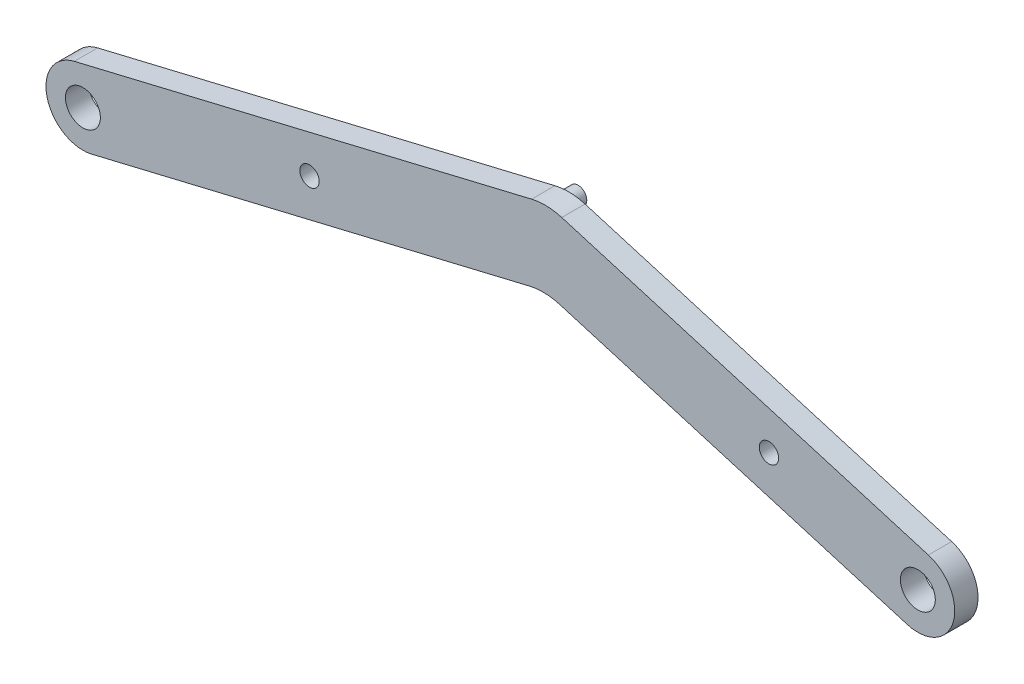
ISO-10303-21;
HEADER;
FILE_DESCRIPTION(('STEP AP214'),'2;1');
FILE_NAME('part.step','',(''),(''),'','','');
FILE_SCHEMA(('AUTOMOTIVE_DESIGN { 1 0 10303 214 1 1 1 1 }'));
ENDSEC;
DATA;
#1=APPLICATION_CONTEXT('core data for automotive mechanical design processes');
#2=APPLICATION_PROTOCOL_DEFINITION('international standard','automotive_design',2000,#1);
#3=PRODUCT_CONTEXT('',#1,'mechanical');
#4=PRODUCT('Part','Part','',(#3));
#5=PRODUCT_RELATED_PRODUCT_CATEGORY('part','',(#4));
#6=PRODUCT_DEFINITION_FORMATION('','',#4);
#7=PRODUCT_DEFINITION_CONTEXT('part definition',#1,'design');
#8=PRODUCT_DEFINITION('design','',#6,#7);
#9=PRODUCT_DEFINITION_SHAPE('','',#8);
#10=(LENGTH_UNIT() NAMED_UNIT(*) SI_UNIT(.MILLI.,.METRE.));
#11=(NAMED_UNIT(*) PLANE_ANGLE_UNIT() SI_UNIT($,.RADIAN.));
#12=(NAMED_UNIT(*) SI_UNIT($,.STERADIAN.) SOLID_ANGLE_UNIT());
#13=UNCERTAINTY_MEASURE_WITH_UNIT(LENGTH_MEASURE(1.E-05),#10,'distance_accuracy_value','');
#14=(GEOMETRIC_REPRESENTATION_CONTEXT(3) GLOBAL_UNCERTAINTY_ASSIGNED_CONTEXT((#13)) GLOBAL_UNIT_ASSIGNED_CONTEXT((#10,
#11,#12)) REPRESENTATION_CONTEXT('',''));
#15=CARTESIAN_POINT('',(0.,0.,0.));
#16=DIRECTION('',(0.,0.,1.));
#17=DIRECTION('',(1.,0.,0.));
#18=AXIS2_PLACEMENT_3D('',#15,#16,#17);
#19=CARTESIAN_POINT('',(215.605449953021,25.518379033542,12.));
#20=DIRECTION('',(0.,0.,1.));
#21=DIRECTION('',(1.,0.,0.));
#22=AXIS2_PLACEMENT_3D('',#19,#20,#21);
#23=PLANE('',#22);
#24=CARTESIAN_POINT('',(-97.6817518723591,53.4132305701706,12.));
#25=DIRECTION('',(0.,0.,1.));
#26=DIRECTION('',(1.,0.,0.));
#27=AXIS2_PLACEMENT_3D('',#24,#25,#26);
#28=CIRCLE('',#27,4.99999999999999);
#29=CARTESIAN_POINT('',(-92.6817518723591,53.4132305701706,12.));
#30=VERTEX_POINT('',#29);
#31=EDGE_CURVE('E215',#30,#30,#28,.T.);
#32=ORIENTED_EDGE('',*,*,#31,.F.);
#33=EDGE_LOOP('',(#32));
#34=FACE_BOUND('',#33,.T.);
#35=CARTESIAN_POINT('',(138.923000663488,48.3175450480715,12.));
#36=DIRECTION('',(0.,0.,1.));
#37=DIRECTION('',(1.,0.,0.));
#38=AXIS2_PLACEMENT_3D('',#35,#36,#37);
#39=CIRCLE('',#38,4.99999999999999);
#40=CARTESIAN_POINT('',(143.923000663488,48.3175450480715,12.));
#41=VERTEX_POINT('',#40);
#42=EDGE_CURVE('E209',#41,#41,#39,.T.);
#43=ORIENTED_EDGE('',*,*,#42,.F.);
#44=EDGE_LOOP('',(#43));
#45=FACE_BOUND('',#44,.T.);
#46=CARTESIAN_POINT('',(-214.394550046979,25.518379033542,12.));
#47=DIRECTION('',(0.,0.,1.));
#48=DIRECTION('',(1.,0.,0.));
#49=AXIS2_PLACEMENT_3D('',#46,#47,#48);
#50=CIRCLE('',#49,8.99999999999998);
#51=CARTESIAN_POINT('',(-205.394550046979,25.518379033542,12.));
#52=VERTEX_POINT('',#51);
#53=EDGE_CURVE('E180',#52,#52,#50,.T.);
#54=ORIENTED_EDGE('',*,*,#53,.F.);
#55=EDGE_LOOP('',(#54));
#56=FACE_BOUND('',#55,.T.);
#57=DIRECTION('',(-0.958530616119172,0.284989575181619,0.));
#58=VECTOR('',#57,1.);
#59=CARTESIAN_POINT('',(24.5175098144283,102.154502749485,12.));
#60=LINE('',#59,#58);
#61=CARTESIAN_POINT('',(221.020251881472,43.7304607398063,12.));
#62=VERTEX_POINT('',#61);
#63=CARTESIAN_POINT('',(32.2226349497175,99.8636209538492,12.));
#64=VERTEX_POINT('',#63);
#65=EDGE_CURVE('E109',#62,#64,#60,.T.);
#66=ORIENTED_EDGE('',*,*,#65,.T.);
#67=CARTESIAN_POINT('',(23.6729476942689,71.107702470274,12.));
#68=DIRECTION('',(0.,0.,1.));
#69=DIRECTION('',(1.,0.,0.));
#70=AXIS2_PLACEMENT_3D('',#67,#68,#69);
#71=CIRCLE('',#70,30.);
#72=CARTESIAN_POINT('',(16.6992348101118,100.285902013929,12.));
#73=VERTEX_POINT('',#72);
#74=EDGE_CURVE('E146',#64,#73,#71,.T.);
#75=ORIENTED_EDGE('',*,*,#74,.T.);
#76=DIRECTION('',(-0.972606651455162,-0.232457096138571,0.));
#77=VECTOR('',#76,1.);
#78=CARTESIAN_POINT('',(-218.811234873611,43.9979054111901,12.));
#79=LINE('',#78,#77);
#80=CARTESIAN_POINT('',(-218.811234873611,43.9979054111901,12.));
#81=VERTEX_POINT('',#80);
#82=EDGE_CURVE('E119',#73,#81,#79,.T.);
#83=ORIENTED_EDGE('',*,*,#82,.T.);
#84=CARTESIAN_POINT('',(-214.394550046979,25.518379033542,12.));
#85=DIRECTION('',(0.,0.,1.));
#86=DIRECTION('',(1.,0.,0.));
#87=AXIS2_PLACEMENT_3D('',#84,#85,#86);
#88=CIRCLE('',#87,19.);
#89=CARTESIAN_POINT('',(-209.977865220346,7.03885265589395,12.));
#90=VERTEX_POINT('',#89);
#91=EDGE_CURVE('E174',#81,#90,#88,.T.);
#92=ORIENTED_EDGE('',*,*,#91,.T.);
#93=DIRECTION('',(0.972606651455162,0.232457096138571,0.));
#94=VECTOR('',#93,1.);
#95=CARTESIAN_POINT('',(-209.977865220346,7.03885265589395,12.));
#96=LINE('',#95,#94);
#97=CARTESIAN_POINT('',(15.6294561245767,60.9599549935946,12.));
#98=VERTEX_POINT('',#97);
#99=EDGE_CURVE('E171',#90,#98,#96,.T.);
#100=ORIENTED_EDGE('',*,*,#99,.T.);
#101=CARTESIAN_POINT('',(22.6031690087338,31.7817554499397,12.));
#102=DIRECTION('',(0.,0.,1.));
#103=DIRECTION('',(1.,0.,0.));
#104=AXIS2_PLACEMENT_3D('',#101,#102,#103);
#105=CIRCLE('',#104,30.);
#106=CARTESIAN_POINT('',(31.1528562641824,60.5376739335149,12.));
#107=VERTEX_POINT('',#106);
#108=EDGE_CURVE('E51',#98,#107,#105,.F.);
#109=ORIENTED_EDGE('',*,*,#108,.T.);
#110=DIRECTION('',(0.958530616119173,-0.284989575181619,0.));
#111=VECTOR('',#110,1.);
#112=CARTESIAN_POINT('',(23.4477311288932,62.828555729151,12.));
#113=LINE('',#112,#111);
#114=CARTESIAN_POINT('',(210.190648024571,7.30629732727781,12.));
#115=VERTEX_POINT('',#114);
#116=EDGE_CURVE('E124',#107,#115,#113,.T.);
#117=ORIENTED_EDGE('',*,*,#116,.T.);
#118=CARTESIAN_POINT('',(215.605449953021,25.518379033542,12.));
#119=DIRECTION('',(0.,0.,1.));
#120=DIRECTION('',(1.,0.,0.));
#121=AXIS2_PLACEMENT_3D('',#118,#119,#120);
#122=CIRCLE('',#121,19.);
#123=EDGE_CURVE('E120',#115,#62,#122,.T.);
#124=ORIENTED_EDGE('',*,*,#123,.T.);
#125=EDGE_LOOP('',(#66,#75,#83,#92,#100,#109,#117,#124));
#126=FACE_BOUND('',#125,.T.);
#127=CARTESIAN_POINT('',(215.605449953021,25.518379033542,12.));
#128=DIRECTION('',(0.,0.,1.));
#129=DIRECTION('',(1.,0.,0.));
#130=AXIS2_PLACEMENT_3D('',#127,#128,#129);
#131=CIRCLE('',#130,9.00000000000001);
#132=CARTESIAN_POINT('',(224.605449953021,25.518379033542,12.));
#133=VERTEX_POINT('',#132);
#134=EDGE_CURVE('E200',#133,#133,#131,.T.);
#135=ORIENTED_EDGE('',*,*,#134,.F.);
#136=EDGE_LOOP('',(#135));
#137=FACE_BOUND('',#136,.T.);
#138=ADVANCED_FACE('F43',(#34,#45,#56,#126,#137),#23,.T.);
#139=CARTESIAN_POINT('',(215.605449953021,25.518379033542,0.));
#140=DIRECTION('',(0.,0.,1.));
#141=DIRECTION('',(1.,0.,0.));
#142=AXIS2_PLACEMENT_3D('',#139,#140,#141);
#143=PLANE('',#142);
#144=CARTESIAN_POINT('',(16.6102147810566,89.9829770622437,0.));
#145=DIRECTION('',(0.,0.,1.));
#146=DIRECTION('',(1.,0.,0.));
#147=AXIS2_PLACEMENT_3D('',#144,#145,#146);
#148=CIRCLE('',#147,4.50000000000001);
#149=CARTESIAN_POINT('',(21.1102147810566,89.9829770622437,0.));
#150=VERTEX_POINT('',#149);
#151=EDGE_CURVE('E11',#150,#150,#148,.F.);
#152=ORIENTED_EDGE('',*,*,#151,.F.);
#153=EDGE_LOOP('',(#152));
#154=FACE_BOUND('',#153,.T.);
#155=CARTESIAN_POINT('',(-97.6817518723591,53.4132305701706,0.));
#156=DIRECTION('',(0.,0.,1.));
#157=DIRECTION('',(1.,0.,0.));
#158=AXIS2_PLACEMENT_3D('',#155,#156,#157);
#159=CIRCLE('',#158,4.99999999999999);
#160=CARTESIAN_POINT('',(-92.6817518723591,53.4132305701706,0.));
#161=VERTEX_POINT('',#160);
#162=EDGE_CURVE('E212',#161,#161,#159,.T.);
#163=ORIENTED_EDGE('',*,*,#162,.T.);
#164=EDGE_LOOP('',(#163));
#165=FACE_BOUND('',#164,.T.);
#166=CARTESIAN_POINT('',(138.923000663488,48.3175450480715,0.));
#167=DIRECTION('',(0.,0.,1.));
#168=DIRECTION('',(1.,0.,0.));
#169=AXIS2_PLACEMENT_3D('',#166,#167,#168);
#170=CIRCLE('',#169,4.99999999999999);
#171=CARTESIAN_POINT('',(143.923000663488,48.3175450480715,0.));
#172=VERTEX_POINT('',#171);
#173=EDGE_CURVE('E206',#172,#172,#170,.T.);
#174=ORIENTED_EDGE('',*,*,#173,.T.);
#175=EDGE_LOOP('',(#174));
#176=FACE_BOUND('',#175,.T.);
#177=CARTESIAN_POINT('',(-214.394550046979,25.518379033542,0.));
#178=DIRECTION('',(0.,0.,1.));
#179=DIRECTION('',(1.,0.,0.));
#180=AXIS2_PLACEMENT_3D('',#177,#178,#179);
#181=CIRCLE('',#180,8.99999999999998);
#182=CARTESIAN_POINT('',(-205.394550046979,25.518379033542,0.));
#183=VERTEX_POINT('',#182);
#184=EDGE_CURVE('E197',#183,#183,#181,.T.);
#185=ORIENTED_EDGE('',*,*,#184,.T.);
#186=EDGE_LOOP('',(#185));
#187=FACE_BOUND('',#186,.T.);
#188=DIRECTION('',(-0.972606651455162,-0.232457096138571,0.));
#189=VECTOR('',#188,1.);
#190=CARTESIAN_POINT('',(-218.811234873611,43.9979054111901,0.));
#191=LINE('',#190,#189);
#192=CARTESIAN_POINT('',(16.6992348101118,100.285902013929,0.));
#193=VERTEX_POINT('',#192);
#194=CARTESIAN_POINT('',(-218.811234873611,43.9979054111901,0.));
#195=VERTEX_POINT('',#194);
#196=EDGE_CURVE('E182',#193,#195,#191,.T.);
#197=ORIENTED_EDGE('',*,*,#196,.F.);
#198=CARTESIAN_POINT('',(23.6729476942689,71.107702470274,0.));
#199=DIRECTION('',(0.,0.,1.));
#200=DIRECTION('',(1.,0.,0.));
#201=AXIS2_PLACEMENT_3D('',#198,#199,#200);
#202=CIRCLE('',#201,30.);
#203=CARTESIAN_POINT('',(32.2226349497175,99.8636209538492,0.));
#204=VERTEX_POINT('',#203);
#205=EDGE_CURVE('E137',#193,#204,#202,.F.);
#206=ORIENTED_EDGE('',*,*,#205,.T.);
#207=DIRECTION('',(-0.958530616119172,0.284989575181619,0.));
#208=VECTOR('',#207,1.);
#209=CARTESIAN_POINT('',(24.5175098144283,102.154502749485,0.));
#210=LINE('',#209,#208);
#211=CARTESIAN_POINT('',(221.020251881472,43.7304607398063,0.));
#212=VERTEX_POINT('',#211);
#213=EDGE_CURVE('E179',#212,#204,#210,.T.);
#214=ORIENTED_EDGE('',*,*,#213,.F.);
#215=CARTESIAN_POINT('',(215.605449953021,25.518379033542,0.));
#216=DIRECTION('',(0.,0.,1.));
#217=DIRECTION('',(1.,0.,0.));
#218=AXIS2_PLACEMENT_3D('',#215,#216,#217);
#219=CIRCLE('',#218,19.);
#220=CARTESIAN_POINT('',(210.190648024571,7.30629732727781,0.));
#221=VERTEX_POINT('',#220);
#222=EDGE_CURVE('E132',#221,#212,#219,.T.);
#223=ORIENTED_EDGE('',*,*,#222,.F.);
#224=DIRECTION('',(0.958530616119173,-0.284989575181619,0.));
#225=VECTOR('',#224,1.);
#226=CARTESIAN_POINT('',(23.4477311288932,62.828555729151,0.));
#227=LINE('',#226,#225);
#228=CARTESIAN_POINT('',(31.1528562641824,60.5376739335149,0.));
#229=VERTEX_POINT('',#228);
#230=EDGE_CURVE('E128',#229,#221,#227,.T.);
#231=ORIENTED_EDGE('',*,*,#230,.F.);
#232=CARTESIAN_POINT('',(22.6031690087338,31.7817554499397,0.));
#233=DIRECTION('',(0.,0.,1.));
#234=DIRECTION('',(1.,0.,0.));
#235=AXIS2_PLACEMENT_3D('',#232,#233,#234);
#236=CIRCLE('',#235,30.);
#237=CARTESIAN_POINT('',(15.6294561245767,60.9599549935946,0.));
#238=VERTEX_POINT('',#237);
#239=EDGE_CURVE('E152',#229,#238,#236,.T.);
#240=ORIENTED_EDGE('',*,*,#239,.T.);
#241=DIRECTION('',(0.972606651455162,0.232457096138571,0.));
#242=VECTOR('',#241,1.);
#243=CARTESIAN_POINT('',(-209.977865220346,7.03885265589395,0.));
#244=LINE('',#243,#242);
#245=CARTESIAN_POINT('',(-209.977865220346,7.03885265589395,0.));
#246=VERTEX_POINT('',#245);
#247=EDGE_CURVE('E160',#246,#238,#244,.T.);
#248=ORIENTED_EDGE('',*,*,#247,.F.);
#249=CARTESIAN_POINT('',(-214.394550046979,25.518379033542,0.));
#250=DIRECTION('',(0.,0.,1.));
#251=DIRECTION('',(1.,0.,0.));
#252=AXIS2_PLACEMENT_3D('',#249,#250,#251);
#253=CIRCLE('',#252,19.);
#254=EDGE_CURVE('E166',#195,#246,#253,.T.);
#255=ORIENTED_EDGE('',*,*,#254,.F.);
#256=EDGE_LOOP('',(#197,#206,#214,#223,#231,#240,#248,#255));
#257=FACE_BOUND('',#256,.T.);
#258=CARTESIAN_POINT('',(215.605449953021,25.518379033542,0.));
#259=DIRECTION('',(0.,0.,1.));
#260=DIRECTION('',(1.,0.,0.));
#261=AXIS2_PLACEMENT_3D('',#258,#259,#260);
#262=CIRCLE('',#261,9.00000000000001);
#263=CARTESIAN_POINT('',(224.605449953021,25.518379033542,0.));
#264=VERTEX_POINT('',#263);
#265=EDGE_CURVE('E203',#264,#264,#262,.T.);
#266=ORIENTED_EDGE('',*,*,#265,.T.);
#267=EDGE_LOOP('',(#266));
#268=FACE_BOUND('',#267,.T.);
#269=ADVANCED_FACE('F157',(#154,#165,#176,#187,#257,#268),#143,.F.);
#270=CARTESIAN_POINT('',(215.605449953021,25.518379033542,12.));
#271=DIRECTION('',(0.,0.,-1.));
#272=DIRECTION('',(-1.,0.,0.));
#273=AXIS2_PLACEMENT_3D('',#270,#271,#272);
#274=CYLINDRICAL_SURFACE('',#273,19.);
#275=ORIENTED_EDGE('',*,*,#222,.T.);
#276=DIRECTION('',(0.,0.,-1.));
#277=VECTOR('',#276,1.);
#278=CARTESIAN_POINT('',(221.020251881472,43.7304607398063,12.));
#279=LINE('',#278,#277);
#280=EDGE_CURVE('E114',#62,#212,#279,.T.);
#281=ORIENTED_EDGE('',*,*,#280,.F.);
#282=ORIENTED_EDGE('',*,*,#123,.F.);
#283=DIRECTION('',(0.,0.,-1.));
#284=VECTOR('',#283,1.);
#285=CARTESIAN_POINT('',(210.190648024571,7.30629732727781,12.));
#286=LINE('',#285,#284);
#287=EDGE_CURVE('E170',#115,#221,#286,.T.);
#288=ORIENTED_EDGE('',*,*,#287,.T.);
#289=EDGE_LOOP('',(#275,#281,#282,#288));
#290=FACE_BOUND('',#289,.T.);
#291=ADVANCED_FACE('F130',(#290),#274,.T.);
#292=CARTESIAN_POINT('',(24.5175098144283,102.154502749485,12.));
#293=DIRECTION('',(-0.284989575181619,-0.958530616119173,0.));
#294=DIRECTION('',(0.958530616119173,-0.284989575181619,0.));
#295=AXIS2_PLACEMENT_3D('',#292,#293,#294);
#296=PLANE('',#295);
#297=ORIENTED_EDGE('',*,*,#213,.T.);
#298=DIRECTION('',(0.,0.,-1.));
#299=VECTOR('',#298,1.);
#300=CARTESIAN_POINT('',(32.2226349497175,99.8636209538492,12.));
#301=LINE('',#300,#299);
#302=EDGE_CURVE('E117',#204,#64,#301,.F.);
#303=ORIENTED_EDGE('',*,*,#302,.T.);
#304=ORIENTED_EDGE('',*,*,#65,.F.);
#305=ORIENTED_EDGE('',*,*,#280,.T.);
#306=EDGE_LOOP('',(#297,#303,#304,#305));
#307=FACE_BOUND('',#306,.T.);
#308=ADVANCED_FACE('F112',(#307),#296,.F.);
#309=CARTESIAN_POINT('',(-218.811234873611,43.9979054111901,12.));
#310=DIRECTION('',(0.232457096138571,-0.972606651455162,0.));
#311=DIRECTION('',(0.972606651455162,0.232457096138571,0.));
#312=AXIS2_PLACEMENT_3D('',#309,#310,#311);
#313=PLANE('',#312);
#314=ORIENTED_EDGE('',*,*,#82,.F.);
#315=DIRECTION('',(0.,0.,-1.));
#316=VECTOR('',#315,1.);
#317=CARTESIAN_POINT('',(16.6992348101118,100.285902013929,12.));
#318=LINE('',#317,#316);
#319=EDGE_CURVE('E133',#73,#193,#318,.T.);
#320=ORIENTED_EDGE('',*,*,#319,.T.);
#321=ORIENTED_EDGE('',*,*,#196,.T.);
#322=DIRECTION('',(0.,0.,-1.));
#323=VECTOR('',#322,1.);
#324=CARTESIAN_POINT('',(-218.811234873611,43.9979054111901,12.));
#325=LINE('',#324,#323);
#326=EDGE_CURVE('E134',#81,#195,#325,.T.);
#327=ORIENTED_EDGE('',*,*,#326,.F.);
#328=EDGE_LOOP('',(#314,#320,#321,#327));
#329=FACE_BOUND('',#328,.T.);
#330=ADVANCED_FACE('F191',(#329),#313,.F.);
#331=CARTESIAN_POINT('',(-214.394550046979,25.518379033542,12.));
#332=DIRECTION('',(0.,0.,-1.));
#333=DIRECTION('',(-1.,0.,0.));
#334=AXIS2_PLACEMENT_3D('',#331,#332,#333);
#335=CYLINDRICAL_SURFACE('',#334,19.);
#336=ORIENTED_EDGE('',*,*,#254,.T.);
#337=DIRECTION('',(0.,0.,-1.));
#338=VECTOR('',#337,1.);
#339=CARTESIAN_POINT('',(-209.977865220346,7.03885265589395,12.));
#340=LINE('',#339,#338);
#341=EDGE_CURVE('E140',#90,#246,#340,.T.);
#342=ORIENTED_EDGE('',*,*,#341,.F.);
#343=ORIENTED_EDGE('',*,*,#91,.F.);
#344=ORIENTED_EDGE('',*,*,#326,.T.);
#345=EDGE_LOOP('',(#336,#342,#343,#344));
#346=FACE_BOUND('',#345,.T.);
#347=ADVANCED_FACE('F186',(#346),#335,.T.);
#348=CARTESIAN_POINT('',(-209.977865220346,7.03885265589395,12.));
#349=DIRECTION('',(-0.232457096138571,0.972606651455162,0.));
#350=DIRECTION('',(-0.972606651455162,-0.232457096138571,0.));
#351=AXIS2_PLACEMENT_3D('',#348,#349,#350);
#352=PLANE('',#351);
#353=ORIENTED_EDGE('',*,*,#247,.T.);
#354=DIRECTION('',(0.,0.,-1.));
#355=VECTOR('',#354,1.);
#356=CARTESIAN_POINT('',(15.6294561245767,60.9599549935946,12.));
#357=LINE('',#356,#355);
#358=EDGE_CURVE('E65',#238,#98,#357,.F.);
#359=ORIENTED_EDGE('',*,*,#358,.T.);
#360=ORIENTED_EDGE('',*,*,#99,.F.);
#361=ORIENTED_EDGE('',*,*,#341,.T.);
#362=EDGE_LOOP('',(#353,#359,#360,#361));
#363=FACE_BOUND('',#362,.T.);
#364=ADVANCED_FACE('F164',(#363),#352,.F.);
#365=CARTESIAN_POINT('',(23.4477311288932,62.828555729151,12.));
#366=DIRECTION('',(0.284989575181619,0.958530616119173,0.));
#367=DIRECTION('',(-0.958530616119173,0.284989575181619,0.));
#368=AXIS2_PLACEMENT_3D('',#365,#366,#367);
#369=PLANE('',#368);
#370=ORIENTED_EDGE('',*,*,#116,.F.);
#371=DIRECTION('',(0.,0.,-1.));
#372=VECTOR('',#371,1.);
#373=CARTESIAN_POINT('',(31.1528562641824,60.5376739335149,0.));
#374=LINE('',#373,#372);
#375=EDGE_CURVE('E148',#107,#229,#374,.T.);
#376=ORIENTED_EDGE('',*,*,#375,.T.);
#377=ORIENTED_EDGE('',*,*,#230,.T.);
#378=ORIENTED_EDGE('',*,*,#287,.F.);
#379=EDGE_LOOP('',(#370,#376,#377,#378));
#380=FACE_BOUND('',#379,.T.);
#381=ADVANCED_FACE('F169',(#380),#369,.F.);
#382=CARTESIAN_POINT('',(-214.394550046979,25.518379033542,12.));
#383=DIRECTION('',(0.,0.,-1.));
#384=DIRECTION('',(-1.,0.,0.));
#385=AXIS2_PLACEMENT_3D('',#382,#383,#384);
#386=CYLINDRICAL_SURFACE('',#385,8.99999999999998);
#387=ORIENTED_EDGE('',*,*,#53,.T.);
#388=EDGE_LOOP('',(#387));
#389=FACE_BOUND('',#388,.T.);
#390=ORIENTED_EDGE('',*,*,#184,.F.);
#391=EDGE_LOOP('',(#390));
#392=FACE_BOUND('',#391,.T.);
#393=ADVANCED_FACE('F242',(#389,#392),#386,.F.);
#394=CARTESIAN_POINT('',(215.605449953021,25.518379033542,12.));
#395=DIRECTION('',(0.,0.,-1.));
#396=DIRECTION('',(-1.,0.,0.));
#397=AXIS2_PLACEMENT_3D('',#394,#395,#396);
#398=CYLINDRICAL_SURFACE('',#397,9.00000000000001);
#399=ORIENTED_EDGE('',*,*,#134,.T.);
#400=EDGE_LOOP('',(#399));
#401=FACE_BOUND('',#400,.T.);
#402=ORIENTED_EDGE('',*,*,#265,.F.);
#403=EDGE_LOOP('',(#402));
#404=FACE_BOUND('',#403,.T.);
#405=ADVANCED_FACE('F244',(#401,#404),#398,.F.);
#406=CARTESIAN_POINT('',(23.6729476942689,71.107702470274,12.));
#407=DIRECTION('',(0.,0.,-1.));
#408=DIRECTION('',(-1.,0.,0.));
#409=AXIS2_PLACEMENT_3D('',#406,#407,#408);
#410=CYLINDRICAL_SURFACE('',#409,30.);
#411=ORIENTED_EDGE('',*,*,#74,.F.);
#412=ORIENTED_EDGE('',*,*,#302,.F.);
#413=ORIENTED_EDGE('',*,*,#205,.F.);
#414=ORIENTED_EDGE('',*,*,#319,.F.);
#415=EDGE_LOOP('',(#411,#412,#413,#414));
#416=FACE_BOUND('',#415,.T.);
#417=ADVANCED_FACE('F194',(#416),#410,.T.);
#418=CARTESIAN_POINT('',(22.6031690087338,31.7817554499397,12.));
#419=DIRECTION('',(0.,0.,1.));
#420=DIRECTION('',(1.,0.,0.));
#421=AXIS2_PLACEMENT_3D('',#418,#419,#420);
#422=CYLINDRICAL_SURFACE('',#421,30.);
#423=ORIENTED_EDGE('',*,*,#108,.F.);
#424=ORIENTED_EDGE('',*,*,#358,.F.);
#425=ORIENTED_EDGE('',*,*,#239,.F.);
#426=ORIENTED_EDGE('',*,*,#375,.F.);
#427=EDGE_LOOP('',(#423,#424,#425,#426));
#428=FACE_BOUND('',#427,.T.);
#429=ADVANCED_FACE('F45',(#428),#422,.F.);
#430=CARTESIAN_POINT('',(138.923000663488,48.3175450480715,0.));
#431=DIRECTION('',(0.,0.,1.));
#432=DIRECTION('',(1.,0.,0.));
#433=AXIS2_PLACEMENT_3D('',#430,#431,#432);
#434=CYLINDRICAL_SURFACE('',#433,4.99999999999999);
#435=ORIENTED_EDGE('',*,*,#173,.F.);
#436=EDGE_LOOP('',(#435));
#437=FACE_BOUND('',#436,.T.);
#438=ORIENTED_EDGE('',*,*,#42,.T.);
#439=EDGE_LOOP('',(#438));
#440=FACE_BOUND('',#439,.T.);
#441=ADVANCED_FACE('F275',(#437,#440),#434,.F.);
#442=CARTESIAN_POINT('',(-97.6817518723591,53.4132305701706,0.));
#443=DIRECTION('',(0.,0.,1.));
#444=DIRECTION('',(1.,0.,0.));
#445=AXIS2_PLACEMENT_3D('',#442,#443,#444);
#446=CYLINDRICAL_SURFACE('',#445,4.99999999999999);
#447=ORIENTED_EDGE('',*,*,#162,.F.);
#448=EDGE_LOOP('',(#447));
#449=FACE_BOUND('',#448,.T.);
#450=ORIENTED_EDGE('',*,*,#31,.T.);
#451=EDGE_LOOP('',(#450));
#452=FACE_BOUND('',#451,.T.);
#453=ADVANCED_FACE('F229',(#449,#452),#446,.F.);
#454=CARTESIAN_POINT('',(16.6102147810566,89.9829770622437,-12.));
#455=DIRECTION('',(0.,0.,1.));
#456=DIRECTION('',(1.,0.,0.));
#457=AXIS2_PLACEMENT_3D('',#454,#455,#456);
#458=CYLINDRICAL_SURFACE('',#457,4.50000000000001);
#459=CARTESIAN_POINT('',(16.6102147810566,89.9829770622437,-12.));
#460=DIRECTION('',(0.,0.,-1.));
#461=DIRECTION('',(-1.,0.,0.));
#462=AXIS2_PLACEMENT_3D('',#459,#460,#461);
#463=CIRCLE('',#462,4.50000000000001);
#464=CARTESIAN_POINT('',(12.1102147810566,89.9829770622437,-12.));
#465=VERTEX_POINT('',#464);
#466=EDGE_CURVE('E218',#465,#465,#463,.T.);
#467=ORIENTED_EDGE('',*,*,#466,.F.);
#468=EDGE_LOOP('',(#467));
#469=FACE_BOUND('',#468,.T.);
#470=ORIENTED_EDGE('',*,*,#151,.T.);
#471=EDGE_LOOP('',(#470));
#472=FACE_BOUND('',#471,.T.);
#473=ADVANCED_FACE('F226',(#469,#472),#458,.T.);
#474=CARTESIAN_POINT('',(16.6102147810566,89.9829770622437,-12.));
#475=DIRECTION('',(0.,0.,-1.));
#476=DIRECTION('',(-1.,0.,0.));
#477=AXIS2_PLACEMENT_3D('',#474,#475,#476);
#478=PLANE('',#477);
#479=ORIENTED_EDGE('',*,*,#466,.T.);
#480=EDGE_LOOP('',(#479));
#481=FACE_BOUND('',#480,.T.);
#482=ADVANCED_FACE('F224',(#481),#478,.T.);
#483=CLOSED_SHELL('',(#138,#269,#291,#308,#330,#347,#364,#381,#393,#405,#417,#429,#441,#453,
#473,#482));
#484=MANIFOLD_SOLID_BREP('B2',#483);
#485=ADVANCED_BREP_SHAPE_REPRESENTATION('',(#18,#484),#14);
#486=SHAPE_DEFINITION_REPRESENTATION(#9,#485);
ENDSEC;
END-ISO-10303-21;
